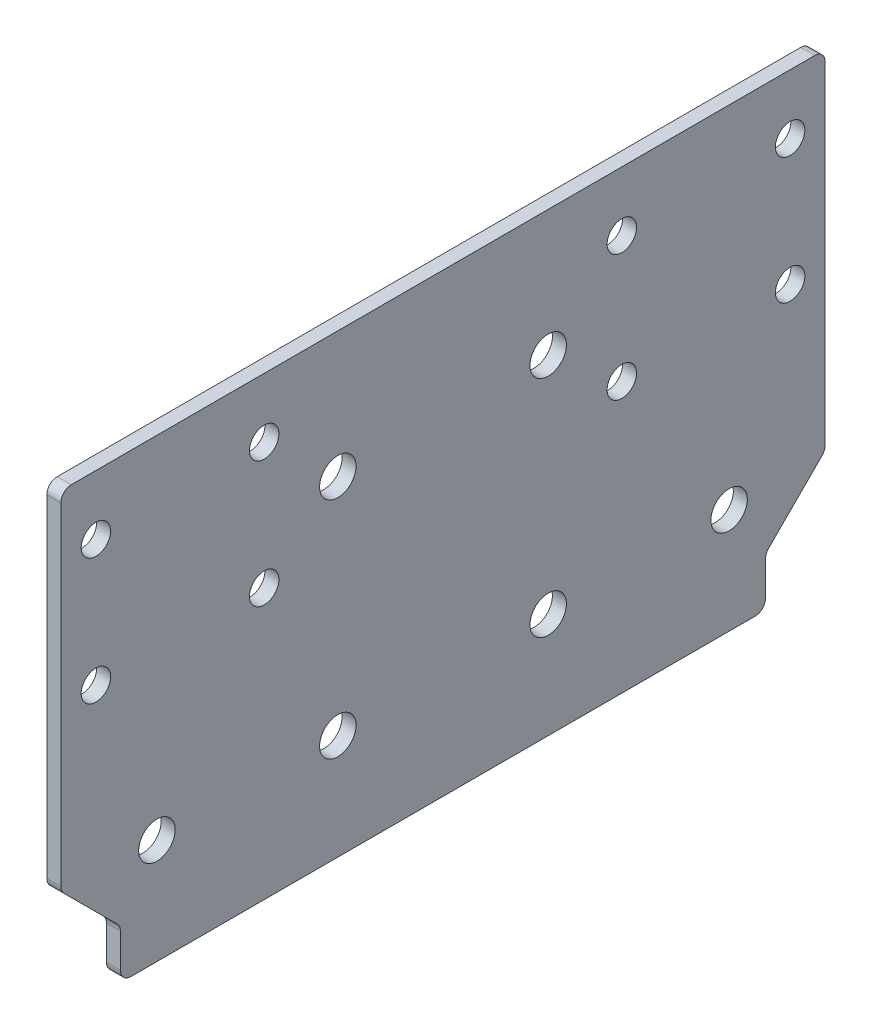
ISO-10303-21;
HEADER;
FILE_DESCRIPTION(('STEP AP214'),'2;1');
FILE_NAME('part.step','',(''),(''),'','','');
FILE_SCHEMA(('AUTOMOTIVE_DESIGN { 1 0 10303 214 1 1 1 1 }'));
ENDSEC;
DATA;
#1=APPLICATION_CONTEXT('core data for automotive mechanical design processes');
#2=APPLICATION_PROTOCOL_DEFINITION('international standard','automotive_design',2000,#1);
#3=PRODUCT_CONTEXT('',#1,'mechanical');
#4=PRODUCT('Part','Part','',(#3));
#5=PRODUCT_RELATED_PRODUCT_CATEGORY('part','',(#4));
#6=PRODUCT_DEFINITION_FORMATION('','',#4);
#7=PRODUCT_DEFINITION_CONTEXT('part definition',#1,'design');
#8=PRODUCT_DEFINITION('design','',#6,#7);
#9=PRODUCT_DEFINITION_SHAPE('','',#8);
#10=(LENGTH_UNIT() NAMED_UNIT(*) SI_UNIT(.MILLI.,.METRE.));
#11=(NAMED_UNIT(*) PLANE_ANGLE_UNIT() SI_UNIT($,.RADIAN.));
#12=(NAMED_UNIT(*) SI_UNIT($,.STERADIAN.) SOLID_ANGLE_UNIT());
#13=UNCERTAINTY_MEASURE_WITH_UNIT(LENGTH_MEASURE(1.E-05),#10,'distance_accuracy_value','');
#14=(GEOMETRIC_REPRESENTATION_CONTEXT(3) GLOBAL_UNCERTAINTY_ASSIGNED_CONTEXT((#13)) GLOBAL_UNIT_ASSIGNED_CONTEXT((#10,
#11,#12)) REPRESENTATION_CONTEXT('',''));
#15=CARTESIAN_POINT('',(0.,0.,0.));
#16=DIRECTION('',(0.,0.,1.));
#17=DIRECTION('',(1.,0.,0.));
#18=AXIS2_PLACEMENT_3D('',#15,#16,#17);
#19=CARTESIAN_POINT('',(2.,0.,0.));
#20=DIRECTION('',(1.,0.,0.));
#21=DIRECTION('',(0.,0.,-1.));
#22=AXIS2_PLACEMENT_3D('',#19,#20,#21);
#23=PLANE('',#22);
#24=CARTESIAN_POINT('',(2.,-18.,-39.5));
#25=DIRECTION('',(1.,0.,0.));
#26=DIRECTION('',(0.,0.,1.));
#27=AXIS2_PLACEMENT_3D('',#24,#25,#26);
#28=CIRCLE('',#27,2.6);
#29=CARTESIAN_POINT('',(2.,-18.,-36.9));
#30=VERTEX_POINT('',#29);
#31=EDGE_CURVE('E431',#30,#30,#28,.T.);
#32=ORIENTED_EDGE('',*,*,#31,.F.);
#33=EDGE_LOOP('',(#32));
#34=FACE_BOUND('',#33,.T.);
#35=CARTESIAN_POINT('',(2.,-18.,-69.5));
#36=DIRECTION('',(1.,0.,0.));
#37=DIRECTION('',(0.,0.,-1.));
#38=AXIS2_PLACEMENT_3D('',#35,#36,#37);
#39=CIRCLE('',#38,2.6);
#40=CARTESIAN_POINT('',(2.,-18.,-72.1));
#41=VERTEX_POINT('',#40);
#42=EDGE_CURVE('E437',#41,#41,#39,.T.);
#43=ORIENTED_EDGE('',*,*,#42,.F.);
#44=EDGE_LOOP('',(#43));
#45=FACE_BOUND('',#44,.T.);
#46=CARTESIAN_POINT('',(2.,-50.,-69.5));
#47=DIRECTION('',(1.,0.,0.));
#48=DIRECTION('',(0.,0.,1.));
#49=AXIS2_PLACEMENT_3D('',#46,#47,#48);
#50=CIRCLE('',#49,2.59999999999999);
#51=CARTESIAN_POINT('',(2.,-50.,-66.9));
#52=VERTEX_POINT('',#51);
#53=EDGE_CURVE('E443',#52,#52,#50,.T.);
#54=ORIENTED_EDGE('',*,*,#53,.F.);
#55=EDGE_LOOP('',(#54));
#56=FACE_BOUND('',#55,.T.);
#57=CARTESIAN_POINT('',(2.,-50.,-95.3));
#58=DIRECTION('',(1.,0.,0.));
#59=DIRECTION('',(0.,0.,1.));
#60=AXIS2_PLACEMENT_3D('',#57,#58,#59);
#61=CIRCLE('',#60,2.6);
#62=CARTESIAN_POINT('',(2.,-50.,-92.7));
#63=VERTEX_POINT('',#62);
#64=EDGE_CURVE('E419',#63,#63,#61,.T.);
#65=ORIENTED_EDGE('',*,*,#64,.F.);
#66=EDGE_LOOP('',(#65));
#67=FACE_BOUND('',#66,.T.);
#68=CARTESIAN_POINT('',(2.,-50.,-39.5));
#69=DIRECTION('',(1.,0.,0.));
#70=DIRECTION('',(0.,0.,-1.));
#71=AXIS2_PLACEMENT_3D('',#68,#69,#70);
#72=CIRCLE('',#71,2.6);
#73=CARTESIAN_POINT('',(2.,-50.,-42.1));
#74=VERTEX_POINT('',#73);
#75=EDGE_CURVE('E426',#74,#74,#72,.T.);
#76=ORIENTED_EDGE('',*,*,#75,.F.);
#77=EDGE_LOOP('',(#76));
#78=FACE_BOUND('',#77,.T.);
#79=CARTESIAN_POINT('',(2.,-50.,-13.7));
#80=DIRECTION('',(1.,0.,0.));
#81=DIRECTION('',(0.,0.,-1.));
#82=AXIS2_PLACEMENT_3D('',#79,#80,#81);
#83=CIRCLE('',#82,2.6);
#84=CARTESIAN_POINT('',(2.,-50.,-16.3));
#85=VERTEX_POINT('',#84);
#86=EDGE_CURVE('E413',#85,#85,#83,.T.);
#87=ORIENTED_EDGE('',*,*,#86,.F.);
#88=EDGE_LOOP('',(#87));
#89=FACE_BOUND('',#88,.T.);
#90=CARTESIAN_POINT('',(2.,-26.5,-29.));
#91=DIRECTION('',(1.,0.,0.));
#92=DIRECTION('',(0.,0.,1.));
#93=AXIS2_PLACEMENT_3D('',#90,#91,#92);
#94=CIRCLE('',#93,2.1);
#95=CARTESIAN_POINT('',(2.,-26.5,-26.9));
#96=VERTEX_POINT('',#95);
#97=EDGE_CURVE('E296',#96,#96,#94,.T.);
#98=ORIENTED_EDGE('',*,*,#97,.F.);
#99=EDGE_LOOP('',(#98));
#100=FACE_BOUND('',#99,.T.);
#101=CARTESIAN_POINT('',(2.,-26.5,-5.00000000000002));
#102=DIRECTION('',(1.,0.,0.));
#103=DIRECTION('',(0.,0.,-1.));
#104=AXIS2_PLACEMENT_3D('',#101,#102,#103);
#105=CIRCLE('',#104,2.1);
#106=CARTESIAN_POINT('',(2.,-26.5,-7.10000000000002));
#107=VERTEX_POINT('',#106);
#108=EDGE_CURVE('E308',#107,#107,#105,.T.);
#109=ORIENTED_EDGE('',*,*,#108,.F.);
#110=EDGE_LOOP('',(#109));
#111=FACE_BOUND('',#110,.T.);
#112=CARTESIAN_POINT('',(2.,-26.5,-80.));
#113=DIRECTION('',(1.,0.,0.));
#114=DIRECTION('',(0.,0.,-1.));
#115=AXIS2_PLACEMENT_3D('',#112,#113,#114);
#116=CIRCLE('',#115,2.1);
#117=CARTESIAN_POINT('',(2.,-26.5,-82.1));
#118=VERTEX_POINT('',#117);
#119=EDGE_CURVE('E320',#118,#118,#116,.T.);
#120=ORIENTED_EDGE('',*,*,#119,.F.);
#121=EDGE_LOOP('',(#120));
#122=FACE_BOUND('',#121,.T.);
#123=CARTESIAN_POINT('',(2.,-8.5,-104.));
#124=DIRECTION('',(1.,0.,0.));
#125=DIRECTION('',(0.,0.,-1.));
#126=AXIS2_PLACEMENT_3D('',#123,#124,#125);
#127=CIRCLE('',#126,2.1);
#128=CARTESIAN_POINT('',(2.,-8.5,-106.1));
#129=VERTEX_POINT('',#128);
#130=EDGE_CURVE('E176',#129,#129,#127,.T.);
#131=ORIENTED_EDGE('',*,*,#130,.F.);
#132=EDGE_LOOP('',(#131));
#133=FACE_BOUND('',#132,.T.);
#134=DIRECTION('',(0.,0.,1.));
#135=VECTOR('',#134,1.);
#136=CARTESIAN_POINT('',(2.,0.,0.));
#137=LINE('',#136,#135);
#138=CARTESIAN_POINT('',(2.,0.,-107.5));
#139=VERTEX_POINT('',#138);
#140=CARTESIAN_POINT('',(2.,0.,-1.5));
#141=VERTEX_POINT('',#140);
#142=EDGE_CURVE('E184',#139,#141,#137,.T.);
#143=ORIENTED_EDGE('',*,*,#142,.T.);
#144=CARTESIAN_POINT('',(2.,-1.5,-1.5));
#145=DIRECTION('',(1.,0.,0.));
#146=DIRECTION('',(0.,0.,-1.));
#147=AXIS2_PLACEMENT_3D('',#144,#145,#146);
#148=CIRCLE('',#147,1.5);
#149=CARTESIAN_POINT('',(2.,-1.5,0.));
#150=VERTEX_POINT('',#149);
#151=EDGE_CURVE('E219',#141,#150,#148,.T.);
#152=ORIENTED_EDGE('',*,*,#151,.T.);
#153=DIRECTION('',(0.,-1.,0.));
#154=VECTOR('',#153,1.);
#155=CARTESIAN_POINT('',(2.,0.,0.));
#156=LINE('',#155,#154);
#157=CARTESIAN_POINT('',(2.,-48.8786796564406,0.));
#158=VERTEX_POINT('',#157);
#159=EDGE_CURVE('E167',#150,#158,#156,.T.);
#160=ORIENTED_EDGE('',*,*,#159,.T.);
#161=CARTESIAN_POINT('',(2.,-48.8786796564406,-1.50000000000001));
#162=DIRECTION('',(1.,0.,0.));
#163=DIRECTION('',(0.,0.,-1.));
#164=AXIS2_PLACEMENT_3D('',#161,#162,#163);
#165=CIRCLE('',#164,1.5);
#166=CARTESIAN_POINT('',(2.,-49.9393398282204,-0.439339828220194));
#167=VERTEX_POINT('',#166);
#168=EDGE_CURVE('E217',#158,#167,#165,.T.);
#169=ORIENTED_EDGE('',*,*,#168,.T.);
#170=DIRECTION('',(0.,-0.707106781186544,-0.707106781186551));
#171=VECTOR('',#170,1.);
#172=CARTESIAN_POINT('',(2.,-35.,14.5000000000004));
#173=LINE('',#172,#171);
#174=CARTESIAN_POINT('',(2.,-57.56066017178,-8.06066017177983));
#175=VERTEX_POINT('',#174);
#176=EDGE_CURVE('E188',#167,#175,#173,.T.);
#177=ORIENTED_EDGE('',*,*,#176,.T.);
#178=CARTESIAN_POINT('',(2.,-58.6213203435598,-7.00000000000001));
#179=DIRECTION('',(1.,0.,0.));
#180=DIRECTION('',(0.,0.,-1.));
#181=AXIS2_PLACEMENT_3D('',#178,#179,#180);
#182=CIRCLE('',#181,1.5);
#183=CARTESIAN_POINT('',(2.,-58.6213203435598,-8.50000000000001));
#184=VERTEX_POINT('',#183);
#185=EDGE_CURVE('E251',#175,#184,#182,.F.);
#186=ORIENTED_EDGE('',*,*,#185,.T.);
#187=DIRECTION('',(0.,-1.,0.));
#188=VECTOR('',#187,1.);
#189=CARTESIAN_POINT('',(2.,-65.,-8.50000000000001));
#190=LINE('',#189,#188);
#191=CARTESIAN_POINT('',(2.,-63.5,-8.50000000000001));
#192=VERTEX_POINT('',#191);
#193=EDGE_CURVE('E285',#184,#192,#190,.T.);
#194=ORIENTED_EDGE('',*,*,#193,.T.);
#195=CARTESIAN_POINT('',(2.,-63.5,-10.));
#196=DIRECTION('',(1.,0.,0.));
#197=DIRECTION('',(0.,0.,-1.));
#198=AXIS2_PLACEMENT_3D('',#195,#196,#197);
#199=CIRCLE('',#198,1.5);
#200=CARTESIAN_POINT('',(2.,-65.,-10.));
#201=VERTEX_POINT('',#200);
#202=EDGE_CURVE('E215',#192,#201,#199,.T.);
#203=ORIENTED_EDGE('',*,*,#202,.T.);
#204=DIRECTION('',(0.,0.,-1.));
#205=VECTOR('',#204,1.);
#206=CARTESIAN_POINT('',(2.,-65.,-100.5));
#207=LINE('',#206,#205);
#208=CARTESIAN_POINT('',(2.,-65.,-99.));
#209=VERTEX_POINT('',#208);
#210=EDGE_CURVE('E288',#201,#209,#207,.T.);
#211=ORIENTED_EDGE('',*,*,#210,.T.);
#212=CARTESIAN_POINT('',(2.,-63.5,-99.));
#213=DIRECTION('',(1.,0.,0.));
#214=DIRECTION('',(0.,0.,-1.));
#215=AXIS2_PLACEMENT_3D('',#212,#213,#214);
#216=CIRCLE('',#215,1.5);
#217=CARTESIAN_POINT('',(2.,-63.5,-100.5));
#218=VERTEX_POINT('',#217);
#219=EDGE_CURVE('E213',#209,#218,#216,.T.);
#220=ORIENTED_EDGE('',*,*,#219,.T.);
#221=DIRECTION('',(0.,1.,0.));
#222=VECTOR('',#221,1.);
#223=CARTESIAN_POINT('',(2.,-65.,-100.5));
#224=LINE('',#223,#222);
#225=CARTESIAN_POINT('',(2.,-58.62132034356,-100.5));
#226=VERTEX_POINT('',#225);
#227=EDGE_CURVE('E257',#218,#226,#224,.T.);
#228=ORIENTED_EDGE('',*,*,#227,.T.);
#229=CARTESIAN_POINT('',(2.,-58.62132034356,-102.));
#230=DIRECTION('',(1.,0.,0.));
#231=DIRECTION('',(0.,0.,-1.));
#232=AXIS2_PLACEMENT_3D('',#229,#230,#231);
#233=CIRCLE('',#232,1.5);
#234=CARTESIAN_POINT('',(2.,-57.5606601717802,-100.93933982822));
#235=VERTEX_POINT('',#234);
#236=EDGE_CURVE('E40',#226,#235,#233,.F.);
#237=ORIENTED_EDGE('',*,*,#236,.T.);
#238=DIRECTION('',(0.,0.707106781186551,-0.707106781186544));
#239=VECTOR('',#238,1.);
#240=CARTESIAN_POINT('',(2.,-58.0000000000004,-100.5));
#241=LINE('',#240,#239);
#242=CARTESIAN_POINT('',(2.,-49.9393398282205,-108.56066017178));
#243=VERTEX_POINT('',#242);
#244=EDGE_CURVE('E193',#235,#243,#241,.T.);
#245=ORIENTED_EDGE('',*,*,#244,.T.);
#246=CARTESIAN_POINT('',(2.,-48.8786796564407,-107.5));
#247=DIRECTION('',(1.,0.,0.));
#248=DIRECTION('',(0.,0.,-1.));
#249=AXIS2_PLACEMENT_3D('',#246,#247,#248);
#250=CIRCLE('',#249,1.5);
#251=CARTESIAN_POINT('',(2.,-48.8786796564407,-109.));
#252=VERTEX_POINT('',#251);
#253=EDGE_CURVE('E54',#243,#252,#250,.T.);
#254=ORIENTED_EDGE('',*,*,#253,.T.);
#255=DIRECTION('',(0.,1.,0.));
#256=VECTOR('',#255,1.);
#257=CARTESIAN_POINT('',(2.,0.,-109.));
#258=LINE('',#257,#256);
#259=CARTESIAN_POINT('',(2.,-1.5,-109.));
#260=VERTEX_POINT('',#259);
#261=EDGE_CURVE('E333',#252,#260,#258,.T.);
#262=ORIENTED_EDGE('',*,*,#261,.T.);
#263=CARTESIAN_POINT('',(2.,-1.5,-107.5));
#264=DIRECTION('',(1.,0.,0.));
#265=DIRECTION('',(0.,0.,-1.));
#266=AXIS2_PLACEMENT_3D('',#263,#264,#265);
#267=CIRCLE('',#266,1.5);
#268=EDGE_CURVE('E210',#260,#139,#267,.T.);
#269=ORIENTED_EDGE('',*,*,#268,.T.);
#270=EDGE_LOOP('',(#143,#152,#160,#169,#177,#186,#194,#203,#211,#220,#228,#237,#245,#254,#262,#269));
#271=FACE_BOUND('',#270,.T.);
#272=CARTESIAN_POINT('',(2.,-26.5,-104.));
#273=DIRECTION('',(1.,0.,0.));
#274=DIRECTION('',(0.,0.,1.));
#275=AXIS2_PLACEMENT_3D('',#272,#273,#274);
#276=CIRCLE('',#275,2.1);
#277=CARTESIAN_POINT('',(2.,-26.5,-101.9));
#278=VERTEX_POINT('',#277);
#279=EDGE_CURVE('E326',#278,#278,#276,.T.);
#280=ORIENTED_EDGE('',*,*,#279,.F.);
#281=EDGE_LOOP('',(#280));
#282=FACE_BOUND('',#281,.T.);
#283=CARTESIAN_POINT('',(2.,-8.5,-80.));
#284=DIRECTION('',(1.,0.,0.));
#285=DIRECTION('',(0.,0.,1.));
#286=AXIS2_PLACEMENT_3D('',#283,#284,#285);
#287=CIRCLE('',#286,2.1);
#288=CARTESIAN_POINT('',(2.,-8.5,-77.9));
#289=VERTEX_POINT('',#288);
#290=EDGE_CURVE('E314',#289,#289,#287,.T.);
#291=ORIENTED_EDGE('',*,*,#290,.F.);
#292=EDGE_LOOP('',(#291));
#293=FACE_BOUND('',#292,.T.);
#294=CARTESIAN_POINT('',(2.,-8.50000000000002,-5.));
#295=DIRECTION('',(1.,0.,0.));
#296=DIRECTION('',(0.,0.,1.));
#297=AXIS2_PLACEMENT_3D('',#294,#295,#296);
#298=CIRCLE('',#297,2.1);
#299=CARTESIAN_POINT('',(2.,-8.50000000000002,-2.9));
#300=VERTEX_POINT('',#299);
#301=EDGE_CURVE('E302',#300,#300,#298,.T.);
#302=ORIENTED_EDGE('',*,*,#301,.F.);
#303=EDGE_LOOP('',(#302));
#304=FACE_BOUND('',#303,.T.);
#305=CARTESIAN_POINT('',(2.,-8.50000000000001,-29.));
#306=DIRECTION('',(1.,0.,0.));
#307=DIRECTION('',(0.,0.,-1.));
#308=AXIS2_PLACEMENT_3D('',#305,#306,#307);
#309=CIRCLE('',#308,2.1);
#310=CARTESIAN_POINT('',(2.,-8.50000000000001,-31.1));
#311=VERTEX_POINT('',#310);
#312=EDGE_CURVE('E278',#311,#311,#309,.T.);
#313=ORIENTED_EDGE('',*,*,#312,.F.);
#314=EDGE_LOOP('',(#313));
#315=FACE_BOUND('',#314,.T.);
#316=ADVANCED_FACE('F32',(#34,#45,#56,#67,#78,#89,#100,#111,#122,#133,#271,#282,#293,#304,#315),
#23,.T.);
#317=CARTESIAN_POINT('',(0.,0.,0.));
#318=DIRECTION('',(1.,0.,0.));
#319=DIRECTION('',(0.,0.,-1.));
#320=AXIS2_PLACEMENT_3D('',#317,#318,#319);
#321=PLANE('',#320);
#322=CARTESIAN_POINT('',(0.,-18.,-39.5));
#323=DIRECTION('',(1.,0.,0.));
#324=DIRECTION('',(0.,0.,1.));
#325=AXIS2_PLACEMENT_3D('',#322,#323,#324);
#326=CIRCLE('',#325,2.6);
#327=CARTESIAN_POINT('',(0.,-18.,-36.9));
#328=VERTEX_POINT('',#327);
#329=EDGE_CURVE('E434',#328,#328,#326,.T.);
#330=ORIENTED_EDGE('',*,*,#329,.T.);
#331=EDGE_LOOP('',(#330));
#332=FACE_BOUND('',#331,.T.);
#333=CARTESIAN_POINT('',(0.,-18.,-69.5));
#334=DIRECTION('',(1.,0.,0.));
#335=DIRECTION('',(0.,0.,-1.));
#336=AXIS2_PLACEMENT_3D('',#333,#334,#335);
#337=CIRCLE('',#336,2.6);
#338=CARTESIAN_POINT('',(0.,-18.,-72.1));
#339=VERTEX_POINT('',#338);
#340=EDGE_CURVE('E440',#339,#339,#337,.T.);
#341=ORIENTED_EDGE('',*,*,#340,.T.);
#342=EDGE_LOOP('',(#341));
#343=FACE_BOUND('',#342,.T.);
#344=CARTESIAN_POINT('',(0.,-50.,-69.5));
#345=DIRECTION('',(1.,0.,0.));
#346=DIRECTION('',(0.,0.,1.));
#347=AXIS2_PLACEMENT_3D('',#344,#345,#346);
#348=CIRCLE('',#347,2.59999999999999);
#349=CARTESIAN_POINT('',(0.,-50.,-66.9));
#350=VERTEX_POINT('',#349);
#351=EDGE_CURVE('E423',#350,#350,#348,.T.);
#352=ORIENTED_EDGE('',*,*,#351,.T.);
#353=EDGE_LOOP('',(#352));
#354=FACE_BOUND('',#353,.T.);
#355=CARTESIAN_POINT('',(0.,-50.,-95.3));
#356=DIRECTION('',(1.,0.,0.));
#357=DIRECTION('',(0.,0.,1.));
#358=AXIS2_PLACEMENT_3D('',#355,#356,#357);
#359=CIRCLE('',#358,2.6);
#360=CARTESIAN_POINT('',(0.,-50.,-92.7));
#361=VERTEX_POINT('',#360);
#362=EDGE_CURVE('E422',#361,#361,#359,.T.);
#363=ORIENTED_EDGE('',*,*,#362,.T.);
#364=EDGE_LOOP('',(#363));
#365=FACE_BOUND('',#364,.T.);
#366=CARTESIAN_POINT('',(0.,-50.,-39.5));
#367=DIRECTION('',(1.,0.,0.));
#368=DIRECTION('',(0.,0.,-1.));
#369=AXIS2_PLACEMENT_3D('',#366,#367,#368);
#370=CIRCLE('',#369,2.6);
#371=CARTESIAN_POINT('',(0.,-50.,-42.1));
#372=VERTEX_POINT('',#371);
#373=EDGE_CURVE('E416',#372,#372,#370,.T.);
#374=ORIENTED_EDGE('',*,*,#373,.T.);
#375=EDGE_LOOP('',(#374));
#376=FACE_BOUND('',#375,.T.);
#377=CARTESIAN_POINT('',(0.,-50.,-13.7));
#378=DIRECTION('',(1.,0.,0.));
#379=DIRECTION('',(0.,0.,-1.));
#380=AXIS2_PLACEMENT_3D('',#377,#378,#379);
#381=CIRCLE('',#380,2.6);
#382=CARTESIAN_POINT('',(0.,-50.,-16.3));
#383=VERTEX_POINT('',#382);
#384=EDGE_CURVE('E289',#383,#383,#381,.T.);
#385=ORIENTED_EDGE('',*,*,#384,.T.);
#386=EDGE_LOOP('',(#385));
#387=FACE_BOUND('',#386,.T.);
#388=DIRECTION('',(0.,-1.,0.));
#389=VECTOR('',#388,1.);
#390=CARTESIAN_POINT('',(0.,0.,0.));
#391=LINE('',#390,#389);
#392=CARTESIAN_POINT('',(0.,-1.5,0.));
#393=VERTEX_POINT('',#392);
#394=CARTESIAN_POINT('',(0.,-48.8786796564406,0.));
#395=VERTEX_POINT('',#394);
#396=EDGE_CURVE('E164',#393,#395,#391,.T.);
#397=ORIENTED_EDGE('',*,*,#396,.F.);
#398=CARTESIAN_POINT('',(0.,-1.5,-1.5));
#399=DIRECTION('',(1.,0.,0.));
#400=DIRECTION('',(0.,0.,-1.));
#401=AXIS2_PLACEMENT_3D('',#398,#399,#400);
#402=CIRCLE('',#401,1.5);
#403=CARTESIAN_POINT('',(0.,0.,-1.5));
#404=VERTEX_POINT('',#403);
#405=EDGE_CURVE('E146',#393,#404,#402,.F.);
#406=ORIENTED_EDGE('',*,*,#405,.T.);
#407=DIRECTION('',(0.,0.,1.));
#408=VECTOR('',#407,1.);
#409=CARTESIAN_POINT('',(0.,0.,0.));
#410=LINE('',#409,#408);
#411=CARTESIAN_POINT('',(0.,0.,-107.5));
#412=VERTEX_POINT('',#411);
#413=EDGE_CURVE('E178',#412,#404,#410,.T.);
#414=ORIENTED_EDGE('',*,*,#413,.F.);
#415=CARTESIAN_POINT('',(0.,-1.5,-107.5));
#416=DIRECTION('',(1.,0.,0.));
#417=DIRECTION('',(0.,0.,-1.));
#418=AXIS2_PLACEMENT_3D('',#415,#416,#417);
#419=CIRCLE('',#418,1.5);
#420=CARTESIAN_POINT('',(0.,-1.5,-109.));
#421=VERTEX_POINT('',#420);
#422=EDGE_CURVE('E168',#412,#421,#419,.F.);
#423=ORIENTED_EDGE('',*,*,#422,.T.);
#424=DIRECTION('',(0.,1.,0.));
#425=VECTOR('',#424,1.);
#426=CARTESIAN_POINT('',(0.,0.,-109.));
#427=LINE('',#426,#425);
#428=CARTESIAN_POINT('',(0.,-48.8786796564407,-109.));
#429=VERTEX_POINT('',#428);
#430=EDGE_CURVE('E175',#429,#421,#427,.T.);
#431=ORIENTED_EDGE('',*,*,#430,.F.);
#432=CARTESIAN_POINT('',(0.,-48.8786796564407,-107.5));
#433=DIRECTION('',(1.,0.,0.));
#434=DIRECTION('',(0.,0.,-1.));
#435=AXIS2_PLACEMENT_3D('',#432,#433,#434);
#436=CIRCLE('',#435,1.5);
#437=CARTESIAN_POINT('',(0.,-49.9393398282205,-108.56066017178));
#438=VERTEX_POINT('',#437);
#439=EDGE_CURVE('E200',#429,#438,#436,.F.);
#440=ORIENTED_EDGE('',*,*,#439,.T.);
#441=DIRECTION('',(0.,-0.707106781186551,0.707106781186544));
#442=VECTOR('',#441,1.);
#443=CARTESIAN_POINT('',(0.,-79.2499999999999,-79.2500000000007));
#444=LINE('',#443,#442);
#445=CARTESIAN_POINT('',(0.,-57.5606601717802,-100.93933982822));
#446=VERTEX_POINT('',#445);
#447=EDGE_CURVE('E195',#438,#446,#444,.T.);
#448=ORIENTED_EDGE('',*,*,#447,.T.);
#449=CARTESIAN_POINT('',(0.,-58.62132034356,-102.));
#450=DIRECTION('',(1.,0.,0.));
#451=DIRECTION('',(0.,0.,-1.));
#452=AXIS2_PLACEMENT_3D('',#449,#450,#451);
#453=CIRCLE('',#452,1.5);
#454=CARTESIAN_POINT('',(0.,-58.62132034356,-100.5));
#455=VERTEX_POINT('',#454);
#456=EDGE_CURVE('E11',#446,#455,#453,.T.);
#457=ORIENTED_EDGE('',*,*,#456,.T.);
#458=DIRECTION('',(0.,1.,0.));
#459=VECTOR('',#458,1.);
#460=CARTESIAN_POINT('',(0.,-65.,-100.5));
#461=LINE('',#460,#459);
#462=CARTESIAN_POINT('',(0.,-63.5,-100.5));
#463=VERTEX_POINT('',#462);
#464=EDGE_CURVE('E269',#463,#455,#461,.T.);
#465=ORIENTED_EDGE('',*,*,#464,.F.);
#466=CARTESIAN_POINT('',(0.,-63.5,-99.));
#467=DIRECTION('',(1.,0.,0.));
#468=DIRECTION('',(0.,0.,-1.));
#469=AXIS2_PLACEMENT_3D('',#466,#467,#468);
#470=CIRCLE('',#469,1.5);
#471=CARTESIAN_POINT('',(0.,-65.,-99.));
#472=VERTEX_POINT('',#471);
#473=EDGE_CURVE('E202',#463,#472,#470,.F.);
#474=ORIENTED_EDGE('',*,*,#473,.T.);
#475=DIRECTION('',(0.,0.,-1.));
#476=VECTOR('',#475,1.);
#477=CARTESIAN_POINT('',(0.,-65.,-100.5));
#478=LINE('',#477,#476);
#479=CARTESIAN_POINT('',(0.,-65.,-10.));
#480=VERTEX_POINT('',#479);
#481=EDGE_CURVE('E275',#480,#472,#478,.T.);
#482=ORIENTED_EDGE('',*,*,#481,.F.);
#483=CARTESIAN_POINT('',(0.,-63.5,-10.));
#484=DIRECTION('',(1.,0.,0.));
#485=DIRECTION('',(0.,0.,-1.));
#486=AXIS2_PLACEMENT_3D('',#483,#484,#485);
#487=CIRCLE('',#486,1.5);
#488=CARTESIAN_POINT('',(0.,-63.5,-8.50000000000001));
#489=VERTEX_POINT('',#488);
#490=EDGE_CURVE('E204',#480,#489,#487,.F.);
#491=ORIENTED_EDGE('',*,*,#490,.T.);
#492=DIRECTION('',(0.,-1.,0.));
#493=VECTOR('',#492,1.);
#494=CARTESIAN_POINT('',(0.,-65.,-8.50000000000001));
#495=LINE('',#494,#493);
#496=CARTESIAN_POINT('',(0.,-58.6213203435598,-8.50000000000001));
#497=VERTEX_POINT('',#496);
#498=EDGE_CURVE('E281',#497,#489,#495,.T.);
#499=ORIENTED_EDGE('',*,*,#498,.F.);
#500=CARTESIAN_POINT('',(0.,-58.6213203435598,-7.00000000000001));
#501=DIRECTION('',(1.,0.,0.));
#502=DIRECTION('',(0.,0.,-1.));
#503=AXIS2_PLACEMENT_3D('',#500,#501,#502);
#504=CIRCLE('',#503,1.5);
#505=CARTESIAN_POINT('',(0.,-57.56066017178,-8.06066017177983));
#506=VERTEX_POINT('',#505);
#507=EDGE_CURVE('E249',#497,#506,#504,.T.);
#508=ORIENTED_EDGE('',*,*,#507,.T.);
#509=DIRECTION('',(0.,0.707106781186544,0.707106781186551));
#510=VECTOR('',#509,1.);
#511=CARTESIAN_POINT('',(0.,-24.7500000000004,24.7500000000001));
#512=LINE('',#511,#510);
#513=CARTESIAN_POINT('',(0.,-49.9393398282204,-0.439339828220194));
#514=VERTEX_POINT('',#513);
#515=EDGE_CURVE('E191',#506,#514,#512,.T.);
#516=ORIENTED_EDGE('',*,*,#515,.T.);
#517=CARTESIAN_POINT('',(0.,-48.8786796564406,-1.50000000000001));
#518=DIRECTION('',(1.,0.,0.));
#519=DIRECTION('',(0.,0.,-1.));
#520=AXIS2_PLACEMENT_3D('',#517,#518,#519);
#521=CIRCLE('',#520,1.5);
#522=EDGE_CURVE('E157',#514,#395,#521,.F.);
#523=ORIENTED_EDGE('',*,*,#522,.T.);
#524=EDGE_LOOP('',(#397,#406,#414,#423,#431,#440,#448,#457,#465,#474,#482,#491,#499,#508,#516,#523));
#525=FACE_BOUND('',#524,.T.);
#526=CARTESIAN_POINT('',(0.,-8.5,-104.));
#527=DIRECTION('',(1.,0.,0.));
#528=DIRECTION('',(0.,0.,-1.));
#529=AXIS2_PLACEMENT_3D('',#526,#527,#528);
#530=CIRCLE('',#529,2.1);
#531=CARTESIAN_POINT('',(0.,-8.5,-106.1));
#532=VERTEX_POINT('',#531);
#533=EDGE_CURVE('E181',#532,#532,#530,.T.);
#534=ORIENTED_EDGE('',*,*,#533,.T.);
#535=EDGE_LOOP('',(#534));
#536=FACE_BOUND('',#535,.T.);
#537=CARTESIAN_POINT('',(0.,-26.5,-104.));
#538=DIRECTION('',(1.,0.,0.));
#539=DIRECTION('',(0.,0.,1.));
#540=AXIS2_PLACEMENT_3D('',#537,#538,#539);
#541=CIRCLE('',#540,2.1);
#542=CARTESIAN_POINT('',(0.,-26.5,-101.9));
#543=VERTEX_POINT('',#542);
#544=EDGE_CURVE('E323',#543,#543,#541,.T.);
#545=ORIENTED_EDGE('',*,*,#544,.T.);
#546=EDGE_LOOP('',(#545));
#547=FACE_BOUND('',#546,.T.);
#548=CARTESIAN_POINT('',(0.,-26.5,-80.));
#549=DIRECTION('',(1.,0.,0.));
#550=DIRECTION('',(0.,0.,-1.));
#551=AXIS2_PLACEMENT_3D('',#548,#549,#550);
#552=CIRCLE('',#551,2.1);
#553=CARTESIAN_POINT('',(0.,-26.5,-82.1));
#554=VERTEX_POINT('',#553);
#555=EDGE_CURVE('E317',#554,#554,#552,.T.);
#556=ORIENTED_EDGE('',*,*,#555,.T.);
#557=EDGE_LOOP('',(#556));
#558=FACE_BOUND('',#557,.T.);
#559=CARTESIAN_POINT('',(0.,-8.5,-80.));
#560=DIRECTION('',(1.,0.,0.));
#561=DIRECTION('',(0.,0.,1.));
#562=AXIS2_PLACEMENT_3D('',#559,#560,#561);
#563=CIRCLE('',#562,2.1);
#564=CARTESIAN_POINT('',(0.,-8.5,-77.9));
#565=VERTEX_POINT('',#564);
#566=EDGE_CURVE('E311',#565,#565,#563,.T.);
#567=ORIENTED_EDGE('',*,*,#566,.T.);
#568=EDGE_LOOP('',(#567));
#569=FACE_BOUND('',#568,.T.);
#570=CARTESIAN_POINT('',(0.,-26.5,-5.00000000000002));
#571=DIRECTION('',(1.,0.,0.));
#572=DIRECTION('',(0.,0.,-1.));
#573=AXIS2_PLACEMENT_3D('',#570,#571,#572);
#574=CIRCLE('',#573,2.1);
#575=CARTESIAN_POINT('',(0.,-26.5,-7.10000000000002));
#576=VERTEX_POINT('',#575);
#577=EDGE_CURVE('E305',#576,#576,#574,.T.);
#578=ORIENTED_EDGE('',*,*,#577,.T.);
#579=EDGE_LOOP('',(#578));
#580=FACE_BOUND('',#579,.T.);
#581=CARTESIAN_POINT('',(0.,-8.50000000000002,-5.));
#582=DIRECTION('',(1.,0.,0.));
#583=DIRECTION('',(0.,0.,1.));
#584=AXIS2_PLACEMENT_3D('',#581,#582,#583);
#585=CIRCLE('',#584,2.1);
#586=CARTESIAN_POINT('',(0.,-8.50000000000002,-2.9));
#587=VERTEX_POINT('',#586);
#588=EDGE_CURVE('E299',#587,#587,#585,.T.);
#589=ORIENTED_EDGE('',*,*,#588,.T.);
#590=EDGE_LOOP('',(#589));
#591=FACE_BOUND('',#590,.T.);
#592=CARTESIAN_POINT('',(0.,-26.5,-29.));
#593=DIRECTION('',(1.,0.,0.));
#594=DIRECTION('',(0.,0.,1.));
#595=AXIS2_PLACEMENT_3D('',#592,#593,#594);
#596=CIRCLE('',#595,2.1);
#597=CARTESIAN_POINT('',(0.,-26.5,-26.9));
#598=VERTEX_POINT('',#597);
#599=EDGE_CURVE('E294',#598,#598,#596,.T.);
#600=ORIENTED_EDGE('',*,*,#599,.T.);
#601=EDGE_LOOP('',(#600));
#602=FACE_BOUND('',#601,.T.);
#603=CARTESIAN_POINT('',(0.,-8.50000000000001,-29.));
#604=DIRECTION('',(1.,0.,0.));
#605=DIRECTION('',(0.,0.,-1.));
#606=AXIS2_PLACEMENT_3D('',#603,#604,#605);
#607=CIRCLE('',#606,2.1);
#608=CARTESIAN_POINT('',(0.,-8.50000000000001,-31.1));
#609=VERTEX_POINT('',#608);
#610=EDGE_CURVE('E274',#609,#609,#607,.T.);
#611=ORIENTED_EDGE('',*,*,#610,.T.);
#612=EDGE_LOOP('',(#611));
#613=FACE_BOUND('',#612,.T.);
#614=ADVANCED_FACE('F171',(#332,#343,#354,#365,#376,#387,#525,#536,#547,#558,#569,#580,#591,
#602,#613),#321,.F.);
#615=CARTESIAN_POINT('',(2.,0.,0.));
#616=DIRECTION('',(0.,0.,-1.));
#617=DIRECTION('',(0.,1.,0.));
#618=AXIS2_PLACEMENT_3D('',#615,#616,#617);
#619=PLANE('',#618);
#620=ORIENTED_EDGE('',*,*,#159,.F.);
#621=DIRECTION('',(-1.,0.,0.));
#622=VECTOR('',#621,1.);
#623=CARTESIAN_POINT('',(2.,-1.5,0.));
#624=LINE('',#623,#622);
#625=EDGE_CURVE('E150',#150,#393,#624,.T.);
#626=ORIENTED_EDGE('',*,*,#625,.T.);
#627=ORIENTED_EDGE('',*,*,#396,.T.);
#628=DIRECTION('',(1.,0.,0.));
#629=VECTOR('',#628,1.);
#630=CARTESIAN_POINT('',(2.,-48.8786796564406,0.));
#631=LINE('',#630,#629);
#632=EDGE_CURVE('E169',#395,#158,#631,.T.);
#633=ORIENTED_EDGE('',*,*,#632,.T.);
#634=EDGE_LOOP('',(#620,#626,#627,#633));
#635=FACE_BOUND('',#634,.T.);
#636=ADVANCED_FACE('F162',(#635),#619,.F.);
#637=CARTESIAN_POINT('',(2.,0.,-109.));
#638=DIRECTION('',(0.,0.,1.));
#639=DIRECTION('',(1.,0.,0.));
#640=AXIS2_PLACEMENT_3D('',#637,#638,#639);
#641=PLANE('',#640);
#642=ORIENTED_EDGE('',*,*,#261,.F.);
#643=DIRECTION('',(-1.,0.,0.));
#644=VECTOR('',#643,1.);
#645=CARTESIAN_POINT('',(2.,-48.8786796564407,-109.));
#646=LINE('',#645,#644);
#647=EDGE_CURVE('E246',#252,#429,#646,.T.);
#648=ORIENTED_EDGE('',*,*,#647,.T.);
#649=ORIENTED_EDGE('',*,*,#430,.T.);
#650=DIRECTION('',(-1.,0.,0.));
#651=VECTOR('',#650,1.);
#652=CARTESIAN_POINT('',(2.,-1.5,-109.));
#653=LINE('',#652,#651);
#654=EDGE_CURVE('E47',#421,#260,#653,.F.);
#655=ORIENTED_EDGE('',*,*,#654,.T.);
#656=EDGE_LOOP('',(#642,#648,#649,#655));
#657=FACE_BOUND('',#656,.T.);
#658=ADVANCED_FACE('F341',(#657),#641,.F.);
#659=CARTESIAN_POINT('',(2.,0.,0.));
#660=DIRECTION('',(0.,-1.,0.));
#661=DIRECTION('',(0.,0.,-1.));
#662=AXIS2_PLACEMENT_3D('',#659,#660,#661);
#663=PLANE('',#662);
#664=ORIENTED_EDGE('',*,*,#413,.T.);
#665=DIRECTION('',(-1.,0.,0.));
#666=VECTOR('',#665,1.);
#667=CARTESIAN_POINT('',(2.,0.,-1.5));
#668=LINE('',#667,#666);
#669=EDGE_CURVE('E151',#404,#141,#668,.F.);
#670=ORIENTED_EDGE('',*,*,#669,.T.);
#671=ORIENTED_EDGE('',*,*,#142,.F.);
#672=DIRECTION('',(-1.,0.,0.));
#673=VECTOR('',#672,1.);
#674=CARTESIAN_POINT('',(2.,0.,-107.5));
#675=LINE('',#674,#673);
#676=EDGE_CURVE('E156',#139,#412,#675,.T.);
#677=ORIENTED_EDGE('',*,*,#676,.T.);
#678=EDGE_LOOP('',(#664,#670,#671,#677));
#679=FACE_BOUND('',#678,.T.);
#680=ADVANCED_FACE('F338',(#679),#663,.F.);
#681=CARTESIAN_POINT('',(2.,-8.5,-104.));
#682=DIRECTION('',(-1.,0.,0.));
#683=DIRECTION('',(0.,0.,1.));
#684=AXIS2_PLACEMENT_3D('',#681,#682,#683);
#685=CYLINDRICAL_SURFACE('',#684,2.1);
#686=ORIENTED_EDGE('',*,*,#130,.T.);
#687=EDGE_LOOP('',(#686));
#688=FACE_BOUND('',#687,.T.);
#689=ORIENTED_EDGE('',*,*,#533,.F.);
#690=EDGE_LOOP('',(#689));
#691=FACE_BOUND('',#690,.T.);
#692=ADVANCED_FACE('F364',(#688,#691),#685,.F.);
#693=CARTESIAN_POINT('',(2.,-26.5,-104.));
#694=DIRECTION('',(-1.,0.,0.));
#695=DIRECTION('',(0.,0.,1.));
#696=AXIS2_PLACEMENT_3D('',#693,#694,#695);
#697=CYLINDRICAL_SURFACE('',#696,2.1);
#698=ORIENTED_EDGE('',*,*,#279,.T.);
#699=EDGE_LOOP('',(#698));
#700=FACE_BOUND('',#699,.T.);
#701=ORIENTED_EDGE('',*,*,#544,.F.);
#702=EDGE_LOOP('',(#701));
#703=FACE_BOUND('',#702,.T.);
#704=ADVANCED_FACE('F476',(#700,#703),#697,.F.);
#705=CARTESIAN_POINT('',(2.,-26.5,-80.));
#706=DIRECTION('',(-1.,0.,0.));
#707=DIRECTION('',(0.,0.,1.));
#708=AXIS2_PLACEMENT_3D('',#705,#706,#707);
#709=CYLINDRICAL_SURFACE('',#708,2.1);
#710=ORIENTED_EDGE('',*,*,#119,.T.);
#711=EDGE_LOOP('',(#710));
#712=FACE_BOUND('',#711,.T.);
#713=ORIENTED_EDGE('',*,*,#555,.F.);
#714=EDGE_LOOP('',(#713));
#715=FACE_BOUND('',#714,.T.);
#716=ADVANCED_FACE('F519',(#712,#715),#709,.F.);
#717=CARTESIAN_POINT('',(2.,-8.5,-80.));
#718=DIRECTION('',(-1.,0.,0.));
#719=DIRECTION('',(0.,0.,1.));
#720=AXIS2_PLACEMENT_3D('',#717,#718,#719);
#721=CYLINDRICAL_SURFACE('',#720,2.1);
#722=ORIENTED_EDGE('',*,*,#290,.T.);
#723=EDGE_LOOP('',(#722));
#724=FACE_BOUND('',#723,.T.);
#725=ORIENTED_EDGE('',*,*,#566,.F.);
#726=EDGE_LOOP('',(#725));
#727=FACE_BOUND('',#726,.T.);
#728=ADVANCED_FACE('F515',(#724,#727),#721,.F.);
#729=CARTESIAN_POINT('',(2.,-26.5,-5.00000000000002));
#730=DIRECTION('',(-1.,0.,0.));
#731=DIRECTION('',(0.,0.,1.));
#732=AXIS2_PLACEMENT_3D('',#729,#730,#731);
#733=CYLINDRICAL_SURFACE('',#732,2.1);
#734=ORIENTED_EDGE('',*,*,#108,.T.);
#735=EDGE_LOOP('',(#734));
#736=FACE_BOUND('',#735,.T.);
#737=ORIENTED_EDGE('',*,*,#577,.F.);
#738=EDGE_LOOP('',(#737));
#739=FACE_BOUND('',#738,.T.);
#740=ADVANCED_FACE('F511',(#736,#739),#733,.F.);
#741=CARTESIAN_POINT('',(2.,-8.50000000000002,-5.));
#742=DIRECTION('',(-1.,0.,0.));
#743=DIRECTION('',(0.,0.,1.));
#744=AXIS2_PLACEMENT_3D('',#741,#742,#743);
#745=CYLINDRICAL_SURFACE('',#744,2.1);
#746=ORIENTED_EDGE('',*,*,#301,.T.);
#747=EDGE_LOOP('',(#746));
#748=FACE_BOUND('',#747,.T.);
#749=ORIENTED_EDGE('',*,*,#588,.F.);
#750=EDGE_LOOP('',(#749));
#751=FACE_BOUND('',#750,.T.);
#752=ADVANCED_FACE('F504',(#748,#751),#745,.F.);
#753=CARTESIAN_POINT('',(2.,-26.5,-29.));
#754=DIRECTION('',(-1.,0.,0.));
#755=DIRECTION('',(0.,0.,1.));
#756=AXIS2_PLACEMENT_3D('',#753,#754,#755);
#757=CYLINDRICAL_SURFACE('',#756,2.1);
#758=ORIENTED_EDGE('',*,*,#97,.T.);
#759=EDGE_LOOP('',(#758));
#760=FACE_BOUND('',#759,.T.);
#761=ORIENTED_EDGE('',*,*,#599,.F.);
#762=EDGE_LOOP('',(#761));
#763=FACE_BOUND('',#762,.T.);
#764=ADVANCED_FACE('F495',(#760,#763),#757,.F.);
#765=CARTESIAN_POINT('',(2.,-8.50000000000001,-29.));
#766=DIRECTION('',(-1.,0.,0.));
#767=DIRECTION('',(0.,0.,1.));
#768=AXIS2_PLACEMENT_3D('',#765,#766,#767);
#769=CYLINDRICAL_SURFACE('',#768,2.1);
#770=ORIENTED_EDGE('',*,*,#312,.T.);
#771=EDGE_LOOP('',(#770));
#772=FACE_BOUND('',#771,.T.);
#773=ORIENTED_EDGE('',*,*,#610,.F.);
#774=EDGE_LOOP('',(#773));
#775=FACE_BOUND('',#774,.T.);
#776=ADVANCED_FACE('F493',(#772,#775),#769,.F.);
#777=CARTESIAN_POINT('',(0.,-65.,-8.50000000000001));
#778=DIRECTION('',(0.,0.,1.));
#779=DIRECTION('',(1.,0.,0.));
#780=AXIS2_PLACEMENT_3D('',#777,#778,#779);
#781=PLANE('',#780);
#782=ORIENTED_EDGE('',*,*,#193,.F.);
#783=DIRECTION('',(-1.,0.,0.));
#784=VECTOR('',#783,1.);
#785=CARTESIAN_POINT('',(0.,-58.6213203435598,-8.50000000000001));
#786=LINE('',#785,#784);
#787=EDGE_CURVE('E228',#184,#497,#786,.T.);
#788=ORIENTED_EDGE('',*,*,#787,.T.);
#789=ORIENTED_EDGE('',*,*,#498,.T.);
#790=DIRECTION('',(1.,0.,0.));
#791=VECTOR('',#790,1.);
#792=CARTESIAN_POINT('',(0.,-63.5,-8.50000000000001));
#793=LINE('',#792,#791);
#794=EDGE_CURVE('E225',#489,#192,#793,.T.);
#795=ORIENTED_EDGE('',*,*,#794,.T.);
#796=EDGE_LOOP('',(#782,#788,#789,#795));
#797=FACE_BOUND('',#796,.T.);
#798=ADVANCED_FACE('F410',(#797),#781,.T.);
#799=CARTESIAN_POINT('',(0.,-65.,-100.5));
#800=DIRECTION('',(0.,0.,-1.));
#801=DIRECTION('',(-1.,0.,0.));
#802=AXIS2_PLACEMENT_3D('',#799,#800,#801);
#803=PLANE('',#802);
#804=ORIENTED_EDGE('',*,*,#227,.F.);
#805=DIRECTION('',(1.,0.,0.));
#806=VECTOR('',#805,1.);
#807=CARTESIAN_POINT('',(0.,-63.5,-100.5));
#808=LINE('',#807,#806);
#809=EDGE_CURVE('E239',#218,#463,#808,.F.);
#810=ORIENTED_EDGE('',*,*,#809,.T.);
#811=ORIENTED_EDGE('',*,*,#464,.T.);
#812=DIRECTION('',(1.,0.,0.));
#813=VECTOR('',#812,1.);
#814=CARTESIAN_POINT('',(0.,-58.62132034356,-100.5));
#815=LINE('',#814,#813);
#816=EDGE_CURVE('E236',#455,#226,#815,.T.);
#817=ORIENTED_EDGE('',*,*,#816,.T.);
#818=EDGE_LOOP('',(#804,#810,#811,#817));
#819=FACE_BOUND('',#818,.T.);
#820=ADVANCED_FACE('F272',(#819),#803,.T.);
#821=CARTESIAN_POINT('',(0.,-65.,-100.5));
#822=DIRECTION('',(0.,-1.,0.));
#823=DIRECTION('',(0.,0.,-1.));
#824=AXIS2_PLACEMENT_3D('',#821,#822,#823);
#825=PLANE('',#824);
#826=ORIENTED_EDGE('',*,*,#210,.F.);
#827=DIRECTION('',(1.,0.,0.));
#828=VECTOR('',#827,1.);
#829=CARTESIAN_POINT('',(0.,-65.,-10.));
#830=LINE('',#829,#828);
#831=EDGE_CURVE('E234',#201,#480,#830,.F.);
#832=ORIENTED_EDGE('',*,*,#831,.T.);
#833=ORIENTED_EDGE('',*,*,#481,.T.);
#834=DIRECTION('',(1.,0.,0.));
#835=VECTOR('',#834,1.);
#836=CARTESIAN_POINT('',(0.,-65.,-99.));
#837=LINE('',#836,#835);
#838=EDGE_CURVE('E231',#472,#209,#837,.T.);
#839=ORIENTED_EDGE('',*,*,#838,.T.);
#840=EDGE_LOOP('',(#826,#832,#833,#839));
#841=FACE_BOUND('',#840,.T.);
#842=ADVANCED_FACE('F403',(#841),#825,.T.);
#843=CARTESIAN_POINT('',(0.,-50.,-13.7));
#844=DIRECTION('',(1.,0.,0.));
#845=DIRECTION('',(0.,0.,-1.));
#846=AXIS2_PLACEMENT_3D('',#843,#844,#845);
#847=CYLINDRICAL_SURFACE('',#846,2.6);
#848=ORIENTED_EDGE('',*,*,#384,.F.);
#849=EDGE_LOOP('',(#848));
#850=FACE_BOUND('',#849,.T.);
#851=ORIENTED_EDGE('',*,*,#86,.T.);
#852=EDGE_LOOP('',(#851));
#853=FACE_BOUND('',#852,.T.);
#854=ADVANCED_FACE('F570',(#850,#853),#847,.F.);
#855=CARTESIAN_POINT('',(0.,-50.,-39.5));
#856=DIRECTION('',(1.,0.,0.));
#857=DIRECTION('',(0.,0.,-1.));
#858=AXIS2_PLACEMENT_3D('',#855,#856,#857);
#859=CYLINDRICAL_SURFACE('',#858,2.6);
#860=ORIENTED_EDGE('',*,*,#373,.F.);
#861=EDGE_LOOP('',(#860));
#862=FACE_BOUND('',#861,.T.);
#863=ORIENTED_EDGE('',*,*,#75,.T.);
#864=EDGE_LOOP('',(#863));
#865=FACE_BOUND('',#864,.T.);
#866=ADVANCED_FACE('F575',(#862,#865),#859,.F.);
#867=CARTESIAN_POINT('',(0.,-50.,-95.3));
#868=DIRECTION('',(1.,0.,0.));
#869=DIRECTION('',(0.,0.,-1.));
#870=AXIS2_PLACEMENT_3D('',#867,#868,#869);
#871=CYLINDRICAL_SURFACE('',#870,2.6);
#872=ORIENTED_EDGE('',*,*,#362,.F.);
#873=EDGE_LOOP('',(#872));
#874=FACE_BOUND('',#873,.T.);
#875=ORIENTED_EDGE('',*,*,#64,.T.);
#876=EDGE_LOOP('',(#875));
#877=FACE_BOUND('',#876,.T.);
#878=ADVANCED_FACE('F455',(#874,#877),#871,.F.);
#879=CARTESIAN_POINT('',(0.,-50.,-69.5));
#880=DIRECTION('',(1.,0.,0.));
#881=DIRECTION('',(0.,0.,-1.));
#882=AXIS2_PLACEMENT_3D('',#879,#880,#881);
#883=CYLINDRICAL_SURFACE('',#882,2.59999999999999);
#884=ORIENTED_EDGE('',*,*,#351,.F.);
#885=EDGE_LOOP('',(#884));
#886=FACE_BOUND('',#885,.T.);
#887=ORIENTED_EDGE('',*,*,#53,.T.);
#888=EDGE_LOOP('',(#887));
#889=FACE_BOUND('',#888,.T.);
#890=ADVANCED_FACE('F451',(#886,#889),#883,.F.);
#891=CARTESIAN_POINT('',(0.,-18.,-69.5));
#892=DIRECTION('',(1.,0.,0.));
#893=DIRECTION('',(0.,0.,-1.));
#894=AXIS2_PLACEMENT_3D('',#891,#892,#893);
#895=CYLINDRICAL_SURFACE('',#894,2.6);
#896=ORIENTED_EDGE('',*,*,#340,.F.);
#897=EDGE_LOOP('',(#896));
#898=FACE_BOUND('',#897,.T.);
#899=ORIENTED_EDGE('',*,*,#42,.T.);
#900=EDGE_LOOP('',(#899));
#901=FACE_BOUND('',#900,.T.);
#902=ADVANCED_FACE('F454',(#898,#901),#895,.F.);
#903=CARTESIAN_POINT('',(0.,-18.,-39.5));
#904=DIRECTION('',(1.,0.,0.));
#905=DIRECTION('',(0.,0.,-1.));
#906=AXIS2_PLACEMENT_3D('',#903,#904,#905);
#907=CYLINDRICAL_SURFACE('',#906,2.6);
#908=ORIENTED_EDGE('',*,*,#329,.F.);
#909=EDGE_LOOP('',(#908));
#910=FACE_BOUND('',#909,.T.);
#911=ORIENTED_EDGE('',*,*,#31,.T.);
#912=EDGE_LOOP('',(#911));
#913=FACE_BOUND('',#912,.T.);
#914=ADVANCED_FACE('F376',(#910,#913),#907,.F.);
#915=CARTESIAN_POINT('',(2.,-35.,14.5000000000004));
#916=DIRECTION('',(0.,0.707106781186551,-0.707106781186544));
#917=DIRECTION('',(1.,0.,0.));
#918=AXIS2_PLACEMENT_3D('',#915,#916,#917);
#919=PLANE('',#918);
#920=ORIENTED_EDGE('',*,*,#176,.F.);
#921=DIRECTION('',(1.,0.,0.));
#922=VECTOR('',#921,1.);
#923=CARTESIAN_POINT('',(2.,-49.9393398282204,-0.439339828220192));
#924=LINE('',#923,#922);
#925=EDGE_CURVE('E223',#167,#514,#924,.F.);
#926=ORIENTED_EDGE('',*,*,#925,.T.);
#927=ORIENTED_EDGE('',*,*,#515,.F.);
#928=DIRECTION('',(-1.,0.,0.));
#929=VECTOR('',#928,1.);
#930=CARTESIAN_POINT('',(2.,-57.56066017178,-8.06066017177982));
#931=LINE('',#930,#929);
#932=EDGE_CURVE('E221',#506,#175,#931,.F.);
#933=ORIENTED_EDGE('',*,*,#932,.T.);
#934=EDGE_LOOP('',(#920,#926,#927,#933));
#935=FACE_BOUND('',#934,.T.);
#936=ADVANCED_FACE('F373',(#935),#919,.F.);
#937=CARTESIAN_POINT('',(0.,-58.0000000000004,-100.5));
#938=DIRECTION('',(0.,0.707106781186544,0.707106781186551));
#939=DIRECTION('',(1.,0.,0.));
#940=AXIS2_PLACEMENT_3D('',#937,#938,#939);
#941=PLANE('',#940);
#942=ORIENTED_EDGE('',*,*,#244,.F.);
#943=DIRECTION('',(1.,0.,0.));
#944=VECTOR('',#943,1.);
#945=CARTESIAN_POINT('',(0.,-57.5606601717802,-100.93933982822));
#946=LINE('',#945,#944);
#947=EDGE_CURVE('E243',#235,#446,#946,.F.);
#948=ORIENTED_EDGE('',*,*,#947,.T.);
#949=ORIENTED_EDGE('',*,*,#447,.F.);
#950=DIRECTION('',(-1.,0.,0.));
#951=VECTOR('',#950,1.);
#952=CARTESIAN_POINT('',(0.,-49.9393398282205,-108.56066017178));
#953=LINE('',#952,#951);
#954=EDGE_CURVE('E241',#438,#243,#953,.F.);
#955=ORIENTED_EDGE('',*,*,#954,.T.);
#956=EDGE_LOOP('',(#942,#948,#949,#955));
#957=FACE_BOUND('',#956,.T.);
#958=ADVANCED_FACE('F262',(#957),#941,.F.);
#959=CARTESIAN_POINT('',(2.,-1.5,-1.5));
#960=DIRECTION('',(-1.,0.,0.));
#961=DIRECTION('',(0.,0.,1.));
#962=AXIS2_PLACEMENT_3D('',#959,#960,#961);
#963=CYLINDRICAL_SURFACE('',#962,1.5);
#964=ORIENTED_EDGE('',*,*,#151,.F.);
#965=ORIENTED_EDGE('',*,*,#669,.F.);
#966=ORIENTED_EDGE('',*,*,#405,.F.);
#967=ORIENTED_EDGE('',*,*,#625,.F.);
#968=EDGE_LOOP('',(#964,#965,#966,#967));
#969=FACE_BOUND('',#968,.T.);
#970=ADVANCED_FACE('F149',(#969),#963,.T.);
#971=CARTESIAN_POINT('',(2.,-48.8786796564406,-1.50000000000001));
#972=DIRECTION('',(1.,0.,0.));
#973=DIRECTION('',(0.,0.,-1.));
#974=AXIS2_PLACEMENT_3D('',#971,#972,#973);
#975=CYLINDRICAL_SURFACE('',#974,1.5);
#976=ORIENTED_EDGE('',*,*,#522,.F.);
#977=ORIENTED_EDGE('',*,*,#925,.F.);
#978=ORIENTED_EDGE('',*,*,#168,.F.);
#979=ORIENTED_EDGE('',*,*,#632,.F.);
#980=EDGE_LOOP('',(#976,#977,#978,#979));
#981=FACE_BOUND('',#980,.T.);
#982=ADVANCED_FACE('F382',(#981),#975,.T.);
#983=CARTESIAN_POINT('',(0.,-58.6213203435598,-7.00000000000001));
#984=DIRECTION('',(-1.,0.,0.));
#985=DIRECTION('',(0.,0.,1.));
#986=AXIS2_PLACEMENT_3D('',#983,#984,#985);
#987=CYLINDRICAL_SURFACE('',#986,1.5);
#988=ORIENTED_EDGE('',*,*,#185,.F.);
#989=ORIENTED_EDGE('',*,*,#932,.F.);
#990=ORIENTED_EDGE('',*,*,#507,.F.);
#991=ORIENTED_EDGE('',*,*,#787,.F.);
#992=EDGE_LOOP('',(#988,#989,#990,#991));
#993=FACE_BOUND('',#992,.T.);
#994=ADVANCED_FACE('F385',(#993),#987,.F.);
#995=CARTESIAN_POINT('',(0.,-63.5,-10.));
#996=DIRECTION('',(1.,0.,0.));
#997=DIRECTION('',(0.,0.,-1.));
#998=AXIS2_PLACEMENT_3D('',#995,#996,#997);
#999=CYLINDRICAL_SURFACE('',#998,1.5);
#1000=ORIENTED_EDGE('',*,*,#490,.F.);
#1001=ORIENTED_EDGE('',*,*,#831,.F.);
#1002=ORIENTED_EDGE('',*,*,#202,.F.);
#1003=ORIENTED_EDGE('',*,*,#794,.F.);
#1004=EDGE_LOOP('',(#1000,#1001,#1002,#1003));
#1005=FACE_BOUND('',#1004,.T.);
#1006=ADVANCED_FACE('F389',(#1005),#999,.T.);
#1007=CARTESIAN_POINT('',(0.,-63.5,-99.));
#1008=DIRECTION('',(1.,0.,0.));
#1009=DIRECTION('',(0.,0.,-1.));
#1010=AXIS2_PLACEMENT_3D('',#1007,#1008,#1009);
#1011=CYLINDRICAL_SURFACE('',#1010,1.5);
#1012=ORIENTED_EDGE('',*,*,#473,.F.);
#1013=ORIENTED_EDGE('',*,*,#809,.F.);
#1014=ORIENTED_EDGE('',*,*,#219,.F.);
#1015=ORIENTED_EDGE('',*,*,#838,.F.);
#1016=EDGE_LOOP('',(#1012,#1013,#1014,#1015));
#1017=FACE_BOUND('',#1016,.T.);
#1018=ADVANCED_FACE('F350',(#1017),#1011,.T.);
#1019=CARTESIAN_POINT('',(0.,-58.62132034356,-102.));
#1020=DIRECTION('',(1.,0.,0.));
#1021=DIRECTION('',(0.,0.,-1.));
#1022=AXIS2_PLACEMENT_3D('',#1019,#1020,#1021);
#1023=CYLINDRICAL_SURFACE('',#1022,1.5);
#1024=ORIENTED_EDGE('',*,*,#456,.F.);
#1025=ORIENTED_EDGE('',*,*,#947,.F.);
#1026=ORIENTED_EDGE('',*,*,#236,.F.);
#1027=ORIENTED_EDGE('',*,*,#816,.F.);
#1028=EDGE_LOOP('',(#1024,#1025,#1026,#1027));
#1029=FACE_BOUND('',#1028,.T.);
#1030=ADVANCED_FACE('F266',(#1029),#1023,.F.);
#1031=CARTESIAN_POINT('',(2.,-48.8786796564407,-107.5));
#1032=DIRECTION('',(-1.,0.,0.));
#1033=DIRECTION('',(0.,0.,1.));
#1034=AXIS2_PLACEMENT_3D('',#1031,#1032,#1033);
#1035=CYLINDRICAL_SURFACE('',#1034,1.5);
#1036=ORIENTED_EDGE('',*,*,#253,.F.);
#1037=ORIENTED_EDGE('',*,*,#954,.F.);
#1038=ORIENTED_EDGE('',*,*,#439,.F.);
#1039=ORIENTED_EDGE('',*,*,#647,.F.);
#1040=EDGE_LOOP('',(#1036,#1037,#1038,#1039));
#1041=FACE_BOUND('',#1040,.T.);
#1042=ADVANCED_FACE('F344',(#1041),#1035,.T.);
#1043=CARTESIAN_POINT('',(2.,-1.5,-107.5));
#1044=DIRECTION('',(-1.,0.,0.));
#1045=DIRECTION('',(0.,0.,1.));
#1046=AXIS2_PLACEMENT_3D('',#1043,#1044,#1045);
#1047=CYLINDRICAL_SURFACE('',#1046,1.5);
#1048=ORIENTED_EDGE('',*,*,#268,.F.);
#1049=ORIENTED_EDGE('',*,*,#654,.F.);
#1050=ORIENTED_EDGE('',*,*,#422,.F.);
#1051=ORIENTED_EDGE('',*,*,#676,.F.);
#1052=EDGE_LOOP('',(#1048,#1049,#1050,#1051));
#1053=FACE_BOUND('',#1052,.T.);
#1054=ADVANCED_FACE('F34',(#1053),#1047,.T.);
#1055=CLOSED_SHELL('',(#316,#614,#636,#658,#680,#692,#704,#716,#728,#740,#752,#764,#776,#798,
#820,#842,#854,#866,#878,#890,#902,#914,#936,#958,#970,#982,#994,#1006,#1018,#1030,#1042,#1054));
#1056=MANIFOLD_SOLID_BREP('B2',#1055);
#1057=ADVANCED_BREP_SHAPE_REPRESENTATION('',(#18,#1056),#14);
#1058=SHAPE_DEFINITION_REPRESENTATION(#9,#1057);
ENDSEC;
END-ISO-10303-21;
